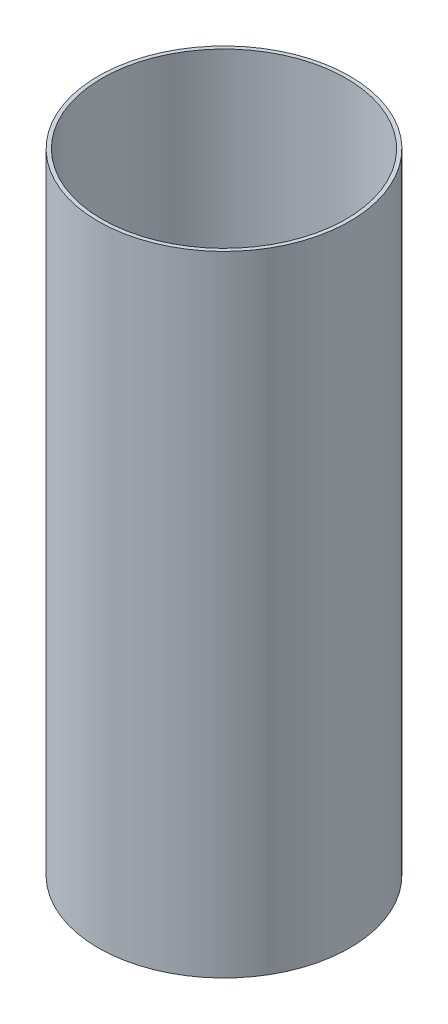
ISO-10303-21;
HEADER;
FILE_DESCRIPTION(('STEP AP214'),'2;1');
FILE_NAME('part.step','',(''),(''),'','','');
FILE_SCHEMA(('AUTOMOTIVE_DESIGN { 1 0 10303 214 1 1 1 1 }'));
ENDSEC;
DATA;
#1=APPLICATION_CONTEXT('core data for automotive mechanical design processes');
#2=APPLICATION_PROTOCOL_DEFINITION('international standard','automotive_design',2000,#1);
#3=PRODUCT_CONTEXT('',#1,'mechanical');
#4=PRODUCT('Part','Part','',(#3));
#5=PRODUCT_RELATED_PRODUCT_CATEGORY('part','',(#4));
#6=PRODUCT_DEFINITION_FORMATION('','',#4);
#7=PRODUCT_DEFINITION_CONTEXT('part definition',#1,'design');
#8=PRODUCT_DEFINITION('design','',#6,#7);
#9=PRODUCT_DEFINITION_SHAPE('','',#8);
#10=(LENGTH_UNIT() NAMED_UNIT(*) SI_UNIT(.MILLI.,.METRE.));
#11=(NAMED_UNIT(*) PLANE_ANGLE_UNIT() SI_UNIT($,.RADIAN.));
#12=(NAMED_UNIT(*) SI_UNIT($,.STERADIAN.) SOLID_ANGLE_UNIT());
#13=UNCERTAINTY_MEASURE_WITH_UNIT(LENGTH_MEASURE(1.E-05),#10,'distance_accuracy_value','');
#14=(GEOMETRIC_REPRESENTATION_CONTEXT(3) GLOBAL_UNCERTAINTY_ASSIGNED_CONTEXT((#13)) GLOBAL_UNIT_ASSIGNED_CONTEXT((#10,
#11,#12)) REPRESENTATION_CONTEXT('',''));
#15=CARTESIAN_POINT('',(0.,0.,0.));
#16=DIRECTION('',(0.,0.,1.));
#17=DIRECTION('',(1.,0.,0.));
#18=AXIS2_PLACEMENT_3D('',#15,#16,#17);
#19=CARTESIAN_POINT('',(0.,381.,0.));
#20=DIRECTION('',(0.,1.,0.));
#21=DIRECTION('',(0.,0.,1.));
#22=AXIS2_PLACEMENT_3D('',#19,#20,#21);
#23=PLANE('',#22);
#24=CARTESIAN_POINT('',(0.,381.,0.));
#25=DIRECTION('',(0.,1.,0.));
#26=DIRECTION('',(0.,0.,1.));
#27=AXIS2_PLACEMENT_3D('',#24,#25,#26);
#28=CIRCLE('',#27,76.1746);
#29=CARTESIAN_POINT('',(0.,381.,76.1746));
#30=VERTEX_POINT('',#29);
#31=EDGE_CURVE('E10',#30,#30,#28,.T.);
#32=ORIENTED_EDGE('',*,*,#31,.T.);
#33=EDGE_LOOP('',(#32));
#34=FACE_BOUND('',#33,.T.);
#35=CARTESIAN_POINT('',(0.,381.,0.));
#36=DIRECTION('',(0.,1.,0.));
#37=DIRECTION('',(0.,0.,1.));
#38=AXIS2_PLACEMENT_3D('',#35,#36,#37);
#39=CIRCLE('',#38,73.914);
#40=CARTESIAN_POINT('',(0.,381.,73.914));
#41=VERTEX_POINT('',#40);
#42=EDGE_CURVE('E42',#41,#41,#39,.T.);
#43=ORIENTED_EDGE('',*,*,#42,.F.);
#44=EDGE_LOOP('',(#43));
#45=FACE_BOUND('',#44,.T.);
#46=ADVANCED_FACE('F31',(#34,#45),#23,.T.);
#47=CARTESIAN_POINT('',(0.,0.,0.));
#48=DIRECTION('',(0.,1.,0.));
#49=DIRECTION('',(0.,0.,1.));
#50=AXIS2_PLACEMENT_3D('',#47,#48,#49);
#51=PLANE('',#50);
#52=CARTESIAN_POINT('',(0.,0.,0.));
#53=DIRECTION('',(0.,1.,0.));
#54=DIRECTION('',(0.,0.,1.));
#55=AXIS2_PLACEMENT_3D('',#52,#53,#54);
#56=CIRCLE('',#55,76.1746);
#57=CARTESIAN_POINT('',(0.,0.,76.1746));
#58=VERTEX_POINT('',#57);
#59=EDGE_CURVE('E35',#58,#58,#56,.T.);
#60=ORIENTED_EDGE('',*,*,#59,.F.);
#61=EDGE_LOOP('',(#60));
#62=FACE_BOUND('',#61,.T.);
#63=CARTESIAN_POINT('',(0.,0.,0.));
#64=DIRECTION('',(0.,1.,0.));
#65=DIRECTION('',(0.,0.,1.));
#66=AXIS2_PLACEMENT_3D('',#63,#64,#65);
#67=CIRCLE('',#66,73.914);
#68=CARTESIAN_POINT('',(0.,0.,73.914));
#69=VERTEX_POINT('',#68);
#70=EDGE_CURVE('E44',#69,#69,#67,.T.);
#71=ORIENTED_EDGE('',*,*,#70,.T.);
#72=EDGE_LOOP('',(#71));
#73=FACE_BOUND('',#72,.T.);
#74=ADVANCED_FACE('F54',(#62,#73),#51,.F.);
#75=CARTESIAN_POINT('',(0.,381.,0.));
#76=DIRECTION('',(0.,-1.,0.));
#77=DIRECTION('',(0.,0.,-1.));
#78=AXIS2_PLACEMENT_3D('',#75,#76,#77);
#79=CYLINDRICAL_SURFACE('',#78,76.1746);
#80=ORIENTED_EDGE('',*,*,#31,.F.);
#81=EDGE_LOOP('',(#80));
#82=FACE_BOUND('',#81,.T.);
#83=ORIENTED_EDGE('',*,*,#59,.T.);
#84=EDGE_LOOP('',(#83));
#85=FACE_BOUND('',#84,.T.);
#86=ADVANCED_FACE('F33',(#82,#85),#79,.T.);
#87=CARTESIAN_POINT('',(0.,381.,0.));
#88=DIRECTION('',(0.,-1.,0.));
#89=DIRECTION('',(0.,0.,-1.));
#90=AXIS2_PLACEMENT_3D('',#87,#88,#89);
#91=CYLINDRICAL_SURFACE('',#90,73.914);
#92=ORIENTED_EDGE('',*,*,#42,.T.);
#93=EDGE_LOOP('',(#92));
#94=FACE_BOUND('',#93,.T.);
#95=ORIENTED_EDGE('',*,*,#70,.F.);
#96=EDGE_LOOP('',(#95));
#97=FACE_BOUND('',#96,.T.);
#98=ADVANCED_FACE('F50',(#94,#97),#91,.F.);
#99=CLOSED_SHELL('',(#46,#74,#86,#98));
#100=MANIFOLD_SOLID_BREP('B2',#99);
#101=ADVANCED_BREP_SHAPE_REPRESENTATION('',(#18,#100),#14);
#102=SHAPE_DEFINITION_REPRESENTATION(#9,#101);
ENDSEC;
END-ISO-10303-21;
